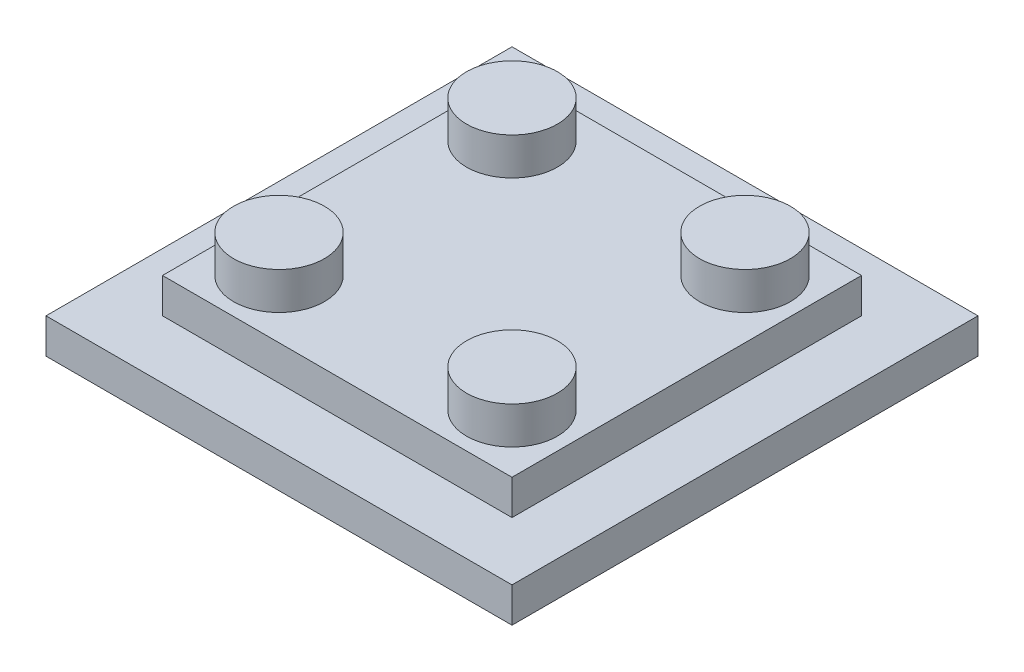
ISO-10303-21;
HEADER;
FILE_DESCRIPTION(('STEP AP214'),'2;1');
FILE_NAME('part.step','',(''),(''),'','','');
FILE_SCHEMA(('AUTOMOTIVE_DESIGN { 1 0 10303 214 1 1 1 1 }'));
ENDSEC;
DATA;
#1=APPLICATION_CONTEXT('core data for automotive mechanical design processes');
#2=APPLICATION_PROTOCOL_DEFINITION('international standard','automotive_design',2000,#1);
#3=PRODUCT_CONTEXT('',#1,'mechanical');
#4=PRODUCT('Part','Part','',(#3));
#5=PRODUCT_RELATED_PRODUCT_CATEGORY('part','',(#4));
#6=PRODUCT_DEFINITION_FORMATION('','',#4);
#7=PRODUCT_DEFINITION_CONTEXT('part definition',#1,'design');
#8=PRODUCT_DEFINITION('design','',#6,#7);
#9=PRODUCT_DEFINITION_SHAPE('','',#8);
#10=(LENGTH_UNIT() NAMED_UNIT(*) SI_UNIT(.MILLI.,.METRE.));
#11=(NAMED_UNIT(*) PLANE_ANGLE_UNIT() SI_UNIT($,.RADIAN.));
#12=(NAMED_UNIT(*) SI_UNIT($,.STERADIAN.) SOLID_ANGLE_UNIT());
#13=UNCERTAINTY_MEASURE_WITH_UNIT(LENGTH_MEASURE(1.E-05),#10,'distance_accuracy_value','');
#14=(GEOMETRIC_REPRESENTATION_CONTEXT(3) GLOBAL_UNCERTAINTY_ASSIGNED_CONTEXT((#13)) GLOBAL_UNIT_ASSIGNED_CONTEXT((#10,
#11,#12)) REPRESENTATION_CONTEXT('',''));
#15=CARTESIAN_POINT('',(0.,0.,0.));
#16=DIRECTION('',(0.,0.,1.));
#17=DIRECTION('',(1.,0.,0.));
#18=AXIS2_PLACEMENT_3D('',#15,#16,#17);
#19=CARTESIAN_POINT('',(15.,3.,0.));
#20=DIRECTION('',(1.,0.,0.));
#21=DIRECTION('',(0.,0.,-1.));
#22=AXIS2_PLACEMENT_3D('',#19,#20,#21);
#23=PLANE('',#22);
#24=DIRECTION('',(0.,0.,1.));
#25=VECTOR('',#24,1.);
#26=CARTESIAN_POINT('',(15.,0.,0.));
#27=LINE('',#26,#25);
#28=CARTESIAN_POINT('',(15.,0.,-15.));
#29=VERTEX_POINT('',#28);
#30=CARTESIAN_POINT('',(15.,0.,15.));
#31=VERTEX_POINT('',#30);
#32=EDGE_CURVE('E186',#29,#31,#27,.T.);
#33=ORIENTED_EDGE('',*,*,#32,.F.);
#34=DIRECTION('',(0.,-1.,0.));
#35=VECTOR('',#34,1.);
#36=CARTESIAN_POINT('',(15.,3.,-15.));
#37=LINE('',#36,#35);
#38=CARTESIAN_POINT('',(15.,3.,-15.));
#39=VERTEX_POINT('',#38);
#40=EDGE_CURVE('E11',#39,#29,#37,.T.);
#41=ORIENTED_EDGE('',*,*,#40,.F.);
#42=DIRECTION('',(0.,0.,1.));
#43=VECTOR('',#42,1.);
#44=CARTESIAN_POINT('',(15.,3.,0.));
#45=LINE('',#44,#43);
#46=CARTESIAN_POINT('',(15.,3.,15.));
#47=VERTEX_POINT('',#46);
#48=EDGE_CURVE('E190',#39,#47,#45,.T.);
#49=ORIENTED_EDGE('',*,*,#48,.T.);
#50=DIRECTION('',(0.,-1.,0.));
#51=VECTOR('',#50,1.);
#52=CARTESIAN_POINT('',(15.,3.,15.));
#53=LINE('',#52,#51);
#54=EDGE_CURVE('E89',#47,#31,#53,.T.);
#55=ORIENTED_EDGE('',*,*,#54,.T.);
#56=EDGE_LOOP('',(#33,#41,#49,#55));
#57=FACE_BOUND('',#56,.T.);
#58=ADVANCED_FACE('F51',(#57),#23,.T.);
#59=CARTESIAN_POINT('',(0.,3.,-15.));
#60=DIRECTION('',(0.,0.,-1.));
#61=DIRECTION('',(-1.,0.,0.));
#62=AXIS2_PLACEMENT_3D('',#59,#60,#61);
#63=PLANE('',#62);
#64=DIRECTION('',(1.,0.,0.));
#65=VECTOR('',#64,1.);
#66=CARTESIAN_POINT('',(0.,0.,-15.));
#67=LINE('',#66,#65);
#68=CARTESIAN_POINT('',(-15.,0.,-15.));
#69=VERTEX_POINT('',#68);
#70=EDGE_CURVE('E206',#69,#29,#67,.T.);
#71=ORIENTED_EDGE('',*,*,#70,.F.);
#72=DIRECTION('',(0.,-1.,0.));
#73=VECTOR('',#72,1.);
#74=CARTESIAN_POINT('',(-15.,3.,-15.));
#75=LINE('',#74,#73);
#76=CARTESIAN_POINT('',(-15.,3.,-15.));
#77=VERTEX_POINT('',#76);
#78=EDGE_CURVE('E60',#77,#69,#75,.T.);
#79=ORIENTED_EDGE('',*,*,#78,.F.);
#80=DIRECTION('',(1.,0.,0.));
#81=VECTOR('',#80,1.);
#82=CARTESIAN_POINT('',(0.,3.,-15.));
#83=LINE('',#82,#81);
#84=EDGE_CURVE('E193',#77,#39,#83,.T.);
#85=ORIENTED_EDGE('',*,*,#84,.T.);
#86=ORIENTED_EDGE('',*,*,#40,.T.);
#87=EDGE_LOOP('',(#71,#79,#85,#86));
#88=FACE_BOUND('',#87,.T.);
#89=ADVANCED_FACE('F225',(#88),#63,.T.);
#90=CARTESIAN_POINT('',(-15.,3.,0.));
#91=DIRECTION('',(1.,0.,0.));
#92=DIRECTION('',(0.,0.,-1.));
#93=AXIS2_PLACEMENT_3D('',#90,#91,#92);
#94=PLANE('',#93);
#95=DIRECTION('',(0.,0.,1.));
#96=VECTOR('',#95,1.);
#97=CARTESIAN_POINT('',(-15.,0.,0.));
#98=LINE('',#97,#96);
#99=CARTESIAN_POINT('',(-15.,0.,15.));
#100=VERTEX_POINT('',#99);
#101=EDGE_CURVE('E82',#69,#100,#98,.T.);
#102=ORIENTED_EDGE('',*,*,#101,.T.);
#103=DIRECTION('',(0.,-1.,0.));
#104=VECTOR('',#103,1.);
#105=CARTESIAN_POINT('',(-15.,3.,15.));
#106=LINE('',#105,#104);
#107=CARTESIAN_POINT('',(-15.,3.,15.));
#108=VERTEX_POINT('',#107);
#109=EDGE_CURVE('E216',#108,#100,#106,.T.);
#110=ORIENTED_EDGE('',*,*,#109,.F.);
#111=DIRECTION('',(0.,0.,1.));
#112=VECTOR('',#111,1.);
#113=CARTESIAN_POINT('',(-15.,3.,0.));
#114=LINE('',#113,#112);
#115=EDGE_CURVE('E198',#77,#108,#114,.T.);
#116=ORIENTED_EDGE('',*,*,#115,.F.);
#117=ORIENTED_EDGE('',*,*,#78,.T.);
#118=EDGE_LOOP('',(#102,#110,#116,#117));
#119=FACE_BOUND('',#118,.T.);
#120=ADVANCED_FACE('F222',(#119),#94,.F.);
#121=CARTESIAN_POINT('',(0.,3.,15.));
#122=DIRECTION('',(0.,0.,-1.));
#123=DIRECTION('',(-1.,0.,0.));
#124=AXIS2_PLACEMENT_3D('',#121,#122,#123);
#125=PLANE('',#124);
#126=DIRECTION('',(1.,0.,0.));
#127=VECTOR('',#126,1.);
#128=CARTESIAN_POINT('',(0.,0.,15.));
#129=LINE('',#128,#127);
#130=EDGE_CURVE('E194',#100,#31,#129,.T.);
#131=ORIENTED_EDGE('',*,*,#130,.T.);
#132=ORIENTED_EDGE('',*,*,#54,.F.);
#133=DIRECTION('',(1.,0.,0.));
#134=VECTOR('',#133,1.);
#135=CARTESIAN_POINT('',(0.,3.,15.));
#136=LINE('',#135,#134);
#137=EDGE_CURVE('E68',#108,#47,#136,.T.);
#138=ORIENTED_EDGE('',*,*,#137,.F.);
#139=ORIENTED_EDGE('',*,*,#109,.T.);
#140=EDGE_LOOP('',(#131,#132,#138,#139));
#141=FACE_BOUND('',#140,.T.);
#142=ADVANCED_FACE('F230',(#141),#125,.F.);
#143=CARTESIAN_POINT('',(0.,3.,0.));
#144=DIRECTION('',(0.,1.,0.));
#145=DIRECTION('',(0.,0.,1.));
#146=AXIS2_PLACEMENT_3D('',#143,#144,#145);
#147=PLANE('',#146);
#148=CARTESIAN_POINT('',(-10.,3.,-10.));
#149=DIRECTION('',(0.,1.,0.));
#150=DIRECTION('',(0.,0.,1.));
#151=AXIS2_PLACEMENT_3D('',#148,#149,#150);
#152=CIRCLE('',#151,3.9);
#153=CARTESIAN_POINT('',(-10.,3.,-6.1));
#154=VERTEX_POINT('',#153);
#155=EDGE_CURVE('E156',#154,#154,#152,.T.);
#156=ORIENTED_EDGE('',*,*,#155,.F.);
#157=EDGE_LOOP('',(#156));
#158=FACE_BOUND('',#157,.T.);
#159=CARTESIAN_POINT('',(10.,3.,-10.));
#160=DIRECTION('',(0.,1.,0.));
#161=DIRECTION('',(0.,0.,1.));
#162=AXIS2_PLACEMENT_3D('',#159,#160,#161);
#163=CIRCLE('',#162,3.9);
#164=CARTESIAN_POINT('',(10.,3.,-6.1));
#165=VERTEX_POINT('',#164);
#166=EDGE_CURVE('E171',#165,#165,#163,.T.);
#167=ORIENTED_EDGE('',*,*,#166,.F.);
#168=EDGE_LOOP('',(#167));
#169=FACE_BOUND('',#168,.T.);
#170=CARTESIAN_POINT('',(10.,3.,10.));
#171=DIRECTION('',(0.,1.,0.));
#172=DIRECTION('',(0.,0.,1.));
#173=AXIS2_PLACEMENT_3D('',#170,#171,#172);
#174=CIRCLE('',#173,3.9);
#175=CARTESIAN_POINT('',(10.,3.,13.9));
#176=VERTEX_POINT('',#175);
#177=EDGE_CURVE('E162',#176,#176,#174,.T.);
#178=ORIENTED_EDGE('',*,*,#177,.F.);
#179=EDGE_LOOP('',(#178));
#180=FACE_BOUND('',#179,.T.);
#181=CARTESIAN_POINT('',(-10.,3.,10.));
#182=DIRECTION('',(0.,1.,0.));
#183=DIRECTION('',(0.,0.,1.));
#184=AXIS2_PLACEMENT_3D('',#181,#182,#183);
#185=CIRCLE('',#184,3.9);
#186=CARTESIAN_POINT('',(-10.,3.,13.9));
#187=VERTEX_POINT('',#186);
#188=EDGE_CURVE('E166',#187,#187,#185,.T.);
#189=ORIENTED_EDGE('',*,*,#188,.F.);
#190=EDGE_LOOP('',(#189));
#191=FACE_BOUND('',#190,.T.);
#192=ORIENTED_EDGE('',*,*,#48,.F.);
#193=ORIENTED_EDGE('',*,*,#84,.F.);
#194=ORIENTED_EDGE('',*,*,#115,.T.);
#195=ORIENTED_EDGE('',*,*,#137,.T.);
#196=EDGE_LOOP('',(#192,#193,#194,#195));
#197=FACE_BOUND('',#196,.T.);
#198=ADVANCED_FACE('F231',(#158,#169,#180,#191,#197),#147,.T.);
#199=CARTESIAN_POINT('',(-10.,6.2,10.));
#200=DIRECTION('',(0.,-1.,0.));
#201=DIRECTION('',(0.,0.,-1.));
#202=AXIS2_PLACEMENT_3D('',#199,#200,#201);
#203=CYLINDRICAL_SURFACE('',#202,3.9);
#204=CARTESIAN_POINT('',(-10.,6.2,10.));
#205=DIRECTION('',(0.,1.,0.));
#206=DIRECTION('',(0.,0.,1.));
#207=AXIS2_PLACEMENT_3D('',#204,#205,#206);
#208=CIRCLE('',#207,3.9);
#209=CARTESIAN_POINT('',(-10.,6.2,13.9));
#210=VERTEX_POINT('',#209);
#211=EDGE_CURVE('E182',#210,#210,#208,.T.);
#212=ORIENTED_EDGE('',*,*,#211,.F.);
#213=EDGE_LOOP('',(#212));
#214=FACE_BOUND('',#213,.T.);
#215=ORIENTED_EDGE('',*,*,#188,.T.);
#216=EDGE_LOOP('',(#215));
#217=FACE_BOUND('',#216,.T.);
#218=ADVANCED_FACE('F233',(#214,#217),#203,.T.);
#219=CARTESIAN_POINT('',(-10.,6.2,10.));
#220=DIRECTION('',(0.,1.,0.));
#221=DIRECTION('',(0.,0.,1.));
#222=AXIS2_PLACEMENT_3D('',#219,#220,#221);
#223=PLANE('',#222);
#224=ORIENTED_EDGE('',*,*,#211,.T.);
#225=EDGE_LOOP('',(#224));
#226=FACE_BOUND('',#225,.T.);
#227=ADVANCED_FACE('F239',(#226),#223,.T.);
#228=CARTESIAN_POINT('',(10.,6.2,10.));
#229=DIRECTION('',(0.,-1.,0.));
#230=DIRECTION('',(0.,0.,-1.));
#231=AXIS2_PLACEMENT_3D('',#228,#229,#230);
#232=CYLINDRICAL_SURFACE('',#231,3.9);
#233=CARTESIAN_POINT('',(10.,6.2,10.));
#234=DIRECTION('',(0.,1.,0.));
#235=DIRECTION('',(0.,0.,1.));
#236=AXIS2_PLACEMENT_3D('',#233,#234,#235);
#237=CIRCLE('',#236,3.9);
#238=CARTESIAN_POINT('',(10.,6.2,13.9));
#239=VERTEX_POINT('',#238);
#240=EDGE_CURVE('E167',#239,#239,#237,.T.);
#241=ORIENTED_EDGE('',*,*,#240,.F.);
#242=EDGE_LOOP('',(#241));
#243=FACE_BOUND('',#242,.T.);
#244=ORIENTED_EDGE('',*,*,#177,.T.);
#245=EDGE_LOOP('',(#244));
#246=FACE_BOUND('',#245,.T.);
#247=ADVANCED_FACE('F366',(#243,#246),#232,.T.);
#248=CARTESIAN_POINT('',(10.,6.2,10.));
#249=DIRECTION('',(0.,1.,0.));
#250=DIRECTION('',(0.,0.,1.));
#251=AXIS2_PLACEMENT_3D('',#248,#249,#250);
#252=PLANE('',#251);
#253=ORIENTED_EDGE('',*,*,#240,.T.);
#254=EDGE_LOOP('',(#253));
#255=FACE_BOUND('',#254,.T.);
#256=ADVANCED_FACE('F356',(#255),#252,.T.);
#257=CARTESIAN_POINT('',(10.,6.2,-10.));
#258=DIRECTION('',(0.,-1.,0.));
#259=DIRECTION('',(0.,0.,-1.));
#260=AXIS2_PLACEMENT_3D('',#257,#258,#259);
#261=CYLINDRICAL_SURFACE('',#260,3.9);
#262=CARTESIAN_POINT('',(10.,6.2,-10.));
#263=DIRECTION('',(0.,1.,0.));
#264=DIRECTION('',(0.,0.,1.));
#265=AXIS2_PLACEMENT_3D('',#262,#263,#264);
#266=CIRCLE('',#265,3.9);
#267=CARTESIAN_POINT('',(10.,6.2,-6.1));
#268=VERTEX_POINT('',#267);
#269=EDGE_CURVE('E175',#268,#268,#266,.T.);
#270=ORIENTED_EDGE('',*,*,#269,.F.);
#271=EDGE_LOOP('',(#270));
#272=FACE_BOUND('',#271,.T.);
#273=ORIENTED_EDGE('',*,*,#166,.T.);
#274=EDGE_LOOP('',(#273));
#275=FACE_BOUND('',#274,.T.);
#276=ADVANCED_FACE('F346',(#272,#275),#261,.T.);
#277=CARTESIAN_POINT('',(10.,6.2,-10.));
#278=DIRECTION('',(0.,1.,0.));
#279=DIRECTION('',(0.,0.,1.));
#280=AXIS2_PLACEMENT_3D('',#277,#278,#279);
#281=PLANE('',#280);
#282=ORIENTED_EDGE('',*,*,#269,.T.);
#283=EDGE_LOOP('',(#282));
#284=FACE_BOUND('',#283,.T.);
#285=ADVANCED_FACE('F336',(#284),#281,.T.);
#286=CARTESIAN_POINT('',(-10.,6.2,-10.));
#287=DIRECTION('',(0.,-1.,0.));
#288=DIRECTION('',(0.,0.,-1.));
#289=AXIS2_PLACEMENT_3D('',#286,#287,#288);
#290=CYLINDRICAL_SURFACE('',#289,3.9);
#291=CARTESIAN_POINT('',(-10.,6.2,-10.));
#292=DIRECTION('',(0.,1.,0.));
#293=DIRECTION('',(0.,0.,1.));
#294=AXIS2_PLACEMENT_3D('',#291,#292,#293);
#295=CIRCLE('',#294,3.9);
#296=CARTESIAN_POINT('',(-10.,6.2,-6.1));
#297=VERTEX_POINT('',#296);
#298=EDGE_CURVE('E150',#297,#297,#295,.T.);
#299=ORIENTED_EDGE('',*,*,#298,.F.);
#300=EDGE_LOOP('',(#299));
#301=FACE_BOUND('',#300,.T.);
#302=ORIENTED_EDGE('',*,*,#155,.T.);
#303=EDGE_LOOP('',(#302));
#304=FACE_BOUND('',#303,.T.);
#305=ADVANCED_FACE('F326',(#301,#304),#290,.T.);
#306=CARTESIAN_POINT('',(-10.,6.2,-10.));
#307=DIRECTION('',(0.,1.,0.));
#308=DIRECTION('',(0.,0.,1.));
#309=AXIS2_PLACEMENT_3D('',#306,#307,#308);
#310=PLANE('',#309);
#311=ORIENTED_EDGE('',*,*,#298,.T.);
#312=EDGE_LOOP('',(#311));
#313=FACE_BOUND('',#312,.T.);
#314=ADVANCED_FACE('F266',(#313),#310,.T.);
#315=CARTESIAN_POINT('',(0.,0.,0.));
#316=DIRECTION('',(0.,-1.,0.));
#317=DIRECTION('',(0.,0.,-1.));
#318=AXIS2_PLACEMENT_3D('',#315,#316,#317);
#319=PLANE('',#318);
#320=DIRECTION('',(0.,0.,1.));
#321=VECTOR('',#320,1.);
#322=CARTESIAN_POINT('',(20.,0.,20.));
#323=LINE('',#322,#321);
#324=CARTESIAN_POINT('',(20.,0.,-20.));
#325=VERTEX_POINT('',#324);
#326=CARTESIAN_POINT('',(20.,0.,20.));
#327=VERTEX_POINT('',#326);
#328=EDGE_CURVE('E148',#325,#327,#323,.T.);
#329=ORIENTED_EDGE('',*,*,#328,.F.);
#330=DIRECTION('',(1.,0.,0.));
#331=VECTOR('',#330,1.);
#332=CARTESIAN_POINT('',(-20.,0.,-20.));
#333=LINE('',#332,#331);
#334=CARTESIAN_POINT('',(-20.,0.,-20.));
#335=VERTEX_POINT('',#334);
#336=EDGE_CURVE('E144',#335,#325,#333,.T.);
#337=ORIENTED_EDGE('',*,*,#336,.F.);
#338=DIRECTION('',(0.,0.,-1.));
#339=VECTOR('',#338,1.);
#340=CARTESIAN_POINT('',(-20.,0.,20.));
#341=LINE('',#340,#339);
#342=CARTESIAN_POINT('',(-20.,0.,20.));
#343=VERTEX_POINT('',#342);
#344=EDGE_CURVE('E444',#343,#335,#341,.T.);
#345=ORIENTED_EDGE('',*,*,#344,.F.);
#346=DIRECTION('',(-1.,0.,0.));
#347=VECTOR('',#346,1.);
#348=CARTESIAN_POINT('',(-20.,0.,20.));
#349=LINE('',#348,#347);
#350=EDGE_CURVE('E448',#327,#343,#349,.T.);
#351=ORIENTED_EDGE('',*,*,#350,.F.);
#352=EDGE_LOOP('',(#329,#337,#345,#351));
#353=FACE_BOUND('',#352,.T.);
#354=ORIENTED_EDGE('',*,*,#70,.T.);
#355=ORIENTED_EDGE('',*,*,#32,.T.);
#356=ORIENTED_EDGE('',*,*,#130,.F.);
#357=ORIENTED_EDGE('',*,*,#101,.F.);
#358=EDGE_LOOP('',(#354,#355,#356,#357));
#359=FACE_BOUND('',#358,.T.);
#360=ADVANCED_FACE('F228',(#353,#359),#319,.F.);
#361=CARTESIAN_POINT('',(20.,-3.,20.));
#362=DIRECTION('',(-1.,0.,0.));
#363=DIRECTION('',(0.,0.,1.));
#364=AXIS2_PLACEMENT_3D('',#361,#362,#363);
#365=PLANE('',#364);
#366=ORIENTED_EDGE('',*,*,#328,.T.);
#367=DIRECTION('',(0.,1.,0.));
#368=VECTOR('',#367,1.);
#369=CARTESIAN_POINT('',(20.,-3.,20.));
#370=LINE('',#369,#368);
#371=CARTESIAN_POINT('',(20.,-3.,20.));
#372=VERTEX_POINT('',#371);
#373=EDGE_CURVE('E126',#372,#327,#370,.T.);
#374=ORIENTED_EDGE('',*,*,#373,.F.);
#375=DIRECTION('',(0.,0.,1.));
#376=VECTOR('',#375,1.);
#377=CARTESIAN_POINT('',(20.,-3.,20.));
#378=LINE('',#377,#376);
#379=CARTESIAN_POINT('',(20.,-3.,-20.));
#380=VERTEX_POINT('',#379);
#381=EDGE_CURVE('E134',#380,#372,#378,.T.);
#382=ORIENTED_EDGE('',*,*,#381,.F.);
#383=DIRECTION('',(0.,1.,0.));
#384=VECTOR('',#383,1.);
#385=CARTESIAN_POINT('',(20.,-3.,-20.));
#386=LINE('',#385,#384);
#387=EDGE_CURVE('E440',#380,#325,#386,.T.);
#388=ORIENTED_EDGE('',*,*,#387,.T.);
#389=EDGE_LOOP('',(#366,#374,#382,#388));
#390=FACE_BOUND('',#389,.T.);
#391=ADVANCED_FACE('F146',(#390),#365,.F.);
#392=CARTESIAN_POINT('',(-20.,-3.,20.));
#393=DIRECTION('',(0.,0.,-1.));
#394=DIRECTION('',(-1.,0.,0.));
#395=AXIS2_PLACEMENT_3D('',#392,#393,#394);
#396=PLANE('',#395);
#397=ORIENTED_EDGE('',*,*,#350,.T.);
#398=DIRECTION('',(0.,1.,0.));
#399=VECTOR('',#398,1.);
#400=CARTESIAN_POINT('',(-20.,-3.,20.));
#401=LINE('',#400,#399);
#402=CARTESIAN_POINT('',(-20.,-3.,20.));
#403=VERTEX_POINT('',#402);
#404=EDGE_CURVE('E129',#403,#343,#401,.T.);
#405=ORIENTED_EDGE('',*,*,#404,.F.);
#406=DIRECTION('',(-1.,0.,0.));
#407=VECTOR('',#406,1.);
#408=CARTESIAN_POINT('',(-20.,-3.,20.));
#409=LINE('',#408,#407);
#410=EDGE_CURVE('E122',#372,#403,#409,.T.);
#411=ORIENTED_EDGE('',*,*,#410,.F.);
#412=ORIENTED_EDGE('',*,*,#373,.T.);
#413=EDGE_LOOP('',(#397,#405,#411,#412));
#414=FACE_BOUND('',#413,.T.);
#415=ADVANCED_FACE('F124',(#414),#396,.F.);
#416=CARTESIAN_POINT('',(-20.,-3.,20.));
#417=DIRECTION('',(1.,0.,0.));
#418=DIRECTION('',(0.,0.,-1.));
#419=AXIS2_PLACEMENT_3D('',#416,#417,#418);
#420=PLANE('',#419);
#421=ORIENTED_EDGE('',*,*,#344,.T.);
#422=DIRECTION('',(0.,1.,0.));
#423=VECTOR('',#422,1.);
#424=CARTESIAN_POINT('',(-20.,-3.,-20.));
#425=LINE('',#424,#423);
#426=CARTESIAN_POINT('',(-20.,-3.,-20.));
#427=VERTEX_POINT('',#426);
#428=EDGE_CURVE('E158',#427,#335,#425,.T.);
#429=ORIENTED_EDGE('',*,*,#428,.F.);
#430=DIRECTION('',(0.,0.,-1.));
#431=VECTOR('',#430,1.);
#432=CARTESIAN_POINT('',(-20.,-3.,20.));
#433=LINE('',#432,#431);
#434=EDGE_CURVE('E133',#403,#427,#433,.T.);
#435=ORIENTED_EDGE('',*,*,#434,.F.);
#436=ORIENTED_EDGE('',*,*,#404,.T.);
#437=EDGE_LOOP('',(#421,#429,#435,#436));
#438=FACE_BOUND('',#437,.T.);
#439=ADVANCED_FACE('F286',(#438),#420,.F.);
#440=CARTESIAN_POINT('',(-20.,-3.,-20.));
#441=DIRECTION('',(0.,0.,1.));
#442=DIRECTION('',(1.,0.,0.));
#443=AXIS2_PLACEMENT_3D('',#440,#441,#442);
#444=PLANE('',#443);
#445=ORIENTED_EDGE('',*,*,#336,.T.);
#446=ORIENTED_EDGE('',*,*,#387,.F.);
#447=DIRECTION('',(1.,0.,0.));
#448=VECTOR('',#447,1.);
#449=CARTESIAN_POINT('',(-20.,-3.,-20.));
#450=LINE('',#449,#448);
#451=EDGE_CURVE('E139',#427,#380,#450,.T.);
#452=ORIENTED_EDGE('',*,*,#451,.F.);
#453=ORIENTED_EDGE('',*,*,#428,.T.);
#454=EDGE_LOOP('',(#445,#446,#452,#453));
#455=FACE_BOUND('',#454,.T.);
#456=ADVANCED_FACE('F295',(#455),#444,.F.);
#457=CARTESIAN_POINT('',(0.,-3.,0.));
#458=DIRECTION('',(0.,-1.,0.));
#459=DIRECTION('',(0.,0.,-1.));
#460=AXIS2_PLACEMENT_3D('',#457,#458,#459);
#461=PLANE('',#460);
#462=ORIENTED_EDGE('',*,*,#381,.T.);
#463=ORIENTED_EDGE('',*,*,#410,.T.);
#464=ORIENTED_EDGE('',*,*,#434,.T.);
#465=ORIENTED_EDGE('',*,*,#451,.T.);
#466=EDGE_LOOP('',(#462,#463,#464,#465));
#467=FACE_BOUND('',#466,.T.);
#468=ADVANCED_FACE('F137',(#467),#461,.T.);
#469=CLOSED_SHELL('',(#58,#89,#120,#142,#198,#218,#227,#247,#256,#276,#285,#305,#314,#360,#391,
#415,#439,#456,#468));
#470=MANIFOLD_SOLID_BREP('B2',#469);
#471=ADVANCED_BREP_SHAPE_REPRESENTATION('',(#18,#470),#14);
#472=SHAPE_DEFINITION_REPRESENTATION(#9,#471);
ENDSEC;
END-ISO-10303-21;
